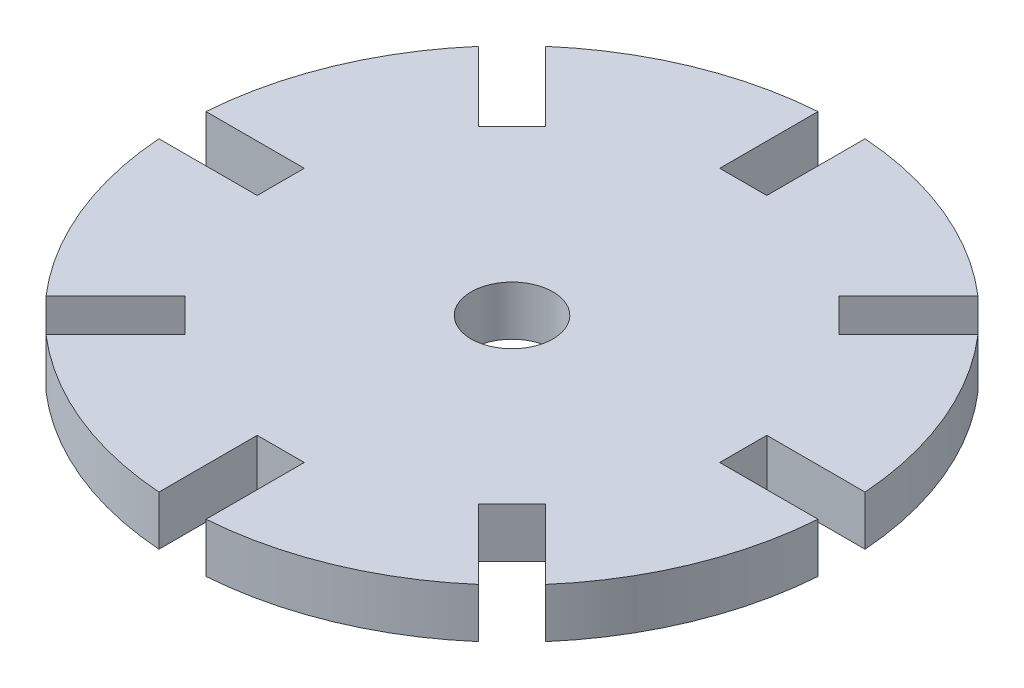
ISO-10303-21;
HEADER;
FILE_DESCRIPTION(('STEP AP214'),'2;1');
FILE_NAME('part.step','',(''),(''),'','','');
FILE_SCHEMA(('AUTOMOTIVE_DESIGN { 1 0 10303 214 1 1 1 1 }'));
ENDSEC;
DATA;
#1=APPLICATION_CONTEXT('core data for automotive mechanical design processes');
#2=APPLICATION_PROTOCOL_DEFINITION('international standard','automotive_design',2000,#1);
#3=PRODUCT_CONTEXT('',#1,'mechanical');
#4=PRODUCT('Part','Part','',(#3));
#5=PRODUCT_RELATED_PRODUCT_CATEGORY('part','',(#4));
#6=PRODUCT_DEFINITION_FORMATION('','',#4);
#7=PRODUCT_DEFINITION_CONTEXT('part definition',#1,'design');
#8=PRODUCT_DEFINITION('design','',#6,#7);
#9=PRODUCT_DEFINITION_SHAPE('','',#8);
#10=(LENGTH_UNIT() NAMED_UNIT(*) SI_UNIT(.MILLI.,.METRE.));
#11=(NAMED_UNIT(*) PLANE_ANGLE_UNIT() SI_UNIT($,.RADIAN.));
#12=(NAMED_UNIT(*) SI_UNIT($,.STERADIAN.) SOLID_ANGLE_UNIT());
#13=UNCERTAINTY_MEASURE_WITH_UNIT(LENGTH_MEASURE(1.E-05),#10,'distance_accuracy_value','');
#14=(GEOMETRIC_REPRESENTATION_CONTEXT(3) GLOBAL_UNCERTAINTY_ASSIGNED_CONTEXT((#13)) GLOBAL_UNIT_ASSIGNED_CONTEXT((#10,
#11,#12)) REPRESENTATION_CONTEXT('',''));
#15=CARTESIAN_POINT('',(0.,0.,0.));
#16=DIRECTION('',(0.,0.,1.));
#17=DIRECTION('',(1.,0.,0.));
#18=AXIS2_PLACEMENT_3D('',#15,#16,#17);
#19=CARTESIAN_POINT('',(0.,-1.5,0.));
#20=DIRECTION('',(0.,1.,0.));
#21=DIRECTION('',(0.,0.,1.));
#22=AXIS2_PLACEMENT_3D('',#19,#20,#21);
#23=CYLINDRICAL_SURFACE('',#22,20.);
#24=DIRECTION('',(0.,1.,0.));
#25=VECTOR('',#24,1.);
#26=CARTESIAN_POINT('',(1.42499999999994,-1.5,19.949169782224));
#27=LINE('',#26,#25);
#28=CARTESIAN_POINT('',(1.42499999999994,-1.5,19.949169782224));
#29=VERTEX_POINT('',#28);
#30=CARTESIAN_POINT('',(1.42499999999994,1.5,19.949169782224));
#31=VERTEX_POINT('',#30);
#32=EDGE_CURVE('E421',#29,#31,#27,.T.);
#33=ORIENTED_EDGE('',*,*,#32,.F.);
#34=CARTESIAN_POINT('',(0.,-1.5,0.));
#35=DIRECTION('',(0.,1.,0.));
#36=DIRECTION('',(0.,0.,1.));
#37=AXIS2_PLACEMENT_3D('',#34,#35,#36);
#38=CIRCLE('',#37,20.);
#39=CARTESIAN_POINT('',(13.0985660688615,-1.5,15.1138203952432));
#40=VERTEX_POINT('',#39);
#41=EDGE_CURVE('E507',#29,#40,#38,.T.);
#42=ORIENTED_EDGE('',*,*,#41,.T.);
#43=DIRECTION('',(0.,1.,0.));
#44=VECTOR('',#43,1.);
#45=CARTESIAN_POINT('',(13.0985660688615,-1.5,15.1138203952432));
#46=LINE('',#45,#44);
#47=CARTESIAN_POINT('',(13.0985660688615,1.5,15.1138203952432));
#48=VERTEX_POINT('',#47);
#49=EDGE_CURVE('E394',#48,#40,#46,.F.);
#50=ORIENTED_EDGE('',*,*,#49,.F.);
#51=CARTESIAN_POINT('',(0.,1.5,0.));
#52=DIRECTION('',(0.,1.,0.));
#53=DIRECTION('',(0.,0.,1.));
#54=AXIS2_PLACEMENT_3D('',#51,#52,#53);
#55=CIRCLE('',#54,20.);
#56=EDGE_CURVE('E533',#31,#48,#55,.T.);
#57=ORIENTED_EDGE('',*,*,#56,.F.);
#58=EDGE_LOOP('',(#33,#42,#50,#57));
#59=FACE_BOUND('',#58,.T.);
#60=ADVANCED_FACE('F45',(#59),#23,.T.);
#61=DIRECTION('',(0.,1.,0.));
#62=VECTOR('',#61,1.);
#63=CARTESIAN_POINT('',(-1.42500000000007,-1.5,19.949169782224));
#64=LINE('',#63,#62);
#65=CARTESIAN_POINT('',(-1.42500000000007,1.5,19.949169782224));
#66=VERTEX_POINT('',#65);
#67=CARTESIAN_POINT('',(-1.42500000000007,-1.5,19.949169782224));
#68=VERTEX_POINT('',#67);
#69=EDGE_CURVE('E419',#66,#68,#64,.F.);
#70=ORIENTED_EDGE('',*,*,#69,.F.);
#71=CARTESIAN_POINT('',(-13.0985660688616,1.5,15.1138203952431));
#72=VERTEX_POINT('',#71);
#73=EDGE_CURVE('E535',#72,#66,#55,.T.);
#74=ORIENTED_EDGE('',*,*,#73,.F.);
#75=DIRECTION('',(0.,1.,0.));
#76=VECTOR('',#75,1.);
#77=CARTESIAN_POINT('',(-13.0985660688616,-1.5,15.1138203952431));
#78=LINE('',#77,#76);
#79=CARTESIAN_POINT('',(-13.0985660688616,-1.5,15.1138203952431));
#80=VERTEX_POINT('',#79);
#81=EDGE_CURVE('E417',#80,#72,#78,.T.);
#82=ORIENTED_EDGE('',*,*,#81,.F.);
#83=EDGE_CURVE('E503',#80,#68,#38,.T.);
#84=ORIENTED_EDGE('',*,*,#83,.T.);
#85=EDGE_LOOP('',(#70,#74,#82,#84));
#86=FACE_BOUND('',#85,.T.);
#87=ADVANCED_FACE('F594',(#86),#23,.T.);
#88=DIRECTION('',(0.,1.,0.));
#89=VECTOR('',#88,1.);
#90=CARTESIAN_POINT('',(-15.1138203952433,-1.5,13.0985660688615));
#91=LINE('',#90,#89);
#92=CARTESIAN_POINT('',(-15.1138203952433,1.5,13.0985660688615));
#93=VERTEX_POINT('',#92);
#94=CARTESIAN_POINT('',(-15.1138203952433,-1.5,13.0985660688615));
#95=VERTEX_POINT('',#94);
#96=EDGE_CURVE('E415',#93,#95,#91,.F.);
#97=ORIENTED_EDGE('',*,*,#96,.F.);
#98=CARTESIAN_POINT('',(-19.949169782224,1.5,1.42500000000001));
#99=VERTEX_POINT('',#98);
#100=EDGE_CURVE('E491',#99,#93,#55,.T.);
#101=ORIENTED_EDGE('',*,*,#100,.F.);
#102=DIRECTION('',(0.,1.,0.));
#103=VECTOR('',#102,1.);
#104=CARTESIAN_POINT('',(-19.949169782224,-1.5,1.42500000000001));
#105=LINE('',#104,#103);
#106=CARTESIAN_POINT('',(-19.949169782224,-1.5,1.42500000000001));
#107=VERTEX_POINT('',#106);
#108=EDGE_CURVE('E413',#107,#99,#105,.T.);
#109=ORIENTED_EDGE('',*,*,#108,.F.);
#110=EDGE_CURVE('E501',#107,#95,#38,.T.);
#111=ORIENTED_EDGE('',*,*,#110,.T.);
#112=EDGE_LOOP('',(#97,#101,#109,#111));
#113=FACE_BOUND('',#112,.T.);
#114=ADVANCED_FACE('F498',(#113),#23,.T.);
#115=DIRECTION('',(0.,1.,0.));
#116=VECTOR('',#115,1.);
#117=CARTESIAN_POINT('',(-19.949169782224,-1.5,-1.425));
#118=LINE('',#117,#116);
#119=CARTESIAN_POINT('',(-19.949169782224,1.5,-1.425));
#120=VERTEX_POINT('',#119);
#121=CARTESIAN_POINT('',(-19.949169782224,-1.5,-1.425));
#122=VERTEX_POINT('',#121);
#123=EDGE_CURVE('E411',#120,#122,#118,.F.);
#124=ORIENTED_EDGE('',*,*,#123,.F.);
#125=CARTESIAN_POINT('',(-15.1138203952431,1.5,-13.0985660688617));
#126=VERTEX_POINT('',#125);
#127=EDGE_CURVE('E539',#126,#120,#55,.T.);
#128=ORIENTED_EDGE('',*,*,#127,.F.);
#129=DIRECTION('',(0.,1.,0.));
#130=VECTOR('',#129,1.);
#131=CARTESIAN_POINT('',(-15.1138203952431,-1.5,-13.0985660688617));
#132=LINE('',#131,#130);
#133=CARTESIAN_POINT('',(-15.1138203952431,-1.5,-13.0985660688617));
#134=VERTEX_POINT('',#133);
#135=EDGE_CURVE('E409',#134,#126,#132,.T.);
#136=ORIENTED_EDGE('',*,*,#135,.F.);
#137=EDGE_CURVE('E502',#134,#122,#38,.T.);
#138=ORIENTED_EDGE('',*,*,#137,.T.);
#139=EDGE_LOOP('',(#124,#128,#136,#138));
#140=FACE_BOUND('',#139,.T.);
#141=ADVANCED_FACE('F574',(#140),#23,.T.);
#142=DIRECTION('',(0.,1.,0.));
#143=VECTOR('',#142,1.);
#144=CARTESIAN_POINT('',(-13.0985660688614,-1.5,-15.1138203952433));
#145=LINE('',#144,#143);
#146=CARTESIAN_POINT('',(-13.0985660688614,1.5,-15.1138203952433));
#147=VERTEX_POINT('',#146);
#148=CARTESIAN_POINT('',(-13.0985660688614,-1.5,-15.1138203952433));
#149=VERTEX_POINT('',#148);
#150=EDGE_CURVE('E407',#147,#149,#145,.F.);
#151=ORIENTED_EDGE('',*,*,#150,.F.);
#152=CARTESIAN_POINT('',(-1.4249999999998,1.5,-19.949169782224));
#153=VERTEX_POINT('',#152);
#154=EDGE_CURVE('E541',#153,#147,#55,.T.);
#155=ORIENTED_EDGE('',*,*,#154,.F.);
#156=DIRECTION('',(0.,1.,0.));
#157=VECTOR('',#156,1.);
#158=CARTESIAN_POINT('',(-1.4249999999998,-1.5,-19.949169782224));
#159=LINE('',#158,#157);
#160=CARTESIAN_POINT('',(-1.4249999999998,-1.5,-19.949169782224));
#161=VERTEX_POINT('',#160);
#162=EDGE_CURVE('E405',#161,#153,#159,.T.);
#163=ORIENTED_EDGE('',*,*,#162,.F.);
#164=EDGE_CURVE('E505',#161,#149,#38,.T.);
#165=ORIENTED_EDGE('',*,*,#164,.T.);
#166=EDGE_LOOP('',(#151,#155,#163,#165));
#167=FACE_BOUND('',#166,.T.);
#168=ADVANCED_FACE('F560',(#167),#23,.T.);
#169=DIRECTION('',(0.,1.,0.));
#170=VECTOR('',#169,1.);
#171=CARTESIAN_POINT('',(1.42500000000021,-1.5,-19.949169782224));
#172=LINE('',#171,#170);
#173=CARTESIAN_POINT('',(1.42500000000021,1.5,-19.949169782224));
#174=VERTEX_POINT('',#173);
#175=CARTESIAN_POINT('',(1.42500000000021,-1.5,-19.949169782224));
#176=VERTEX_POINT('',#175);
#177=EDGE_CURVE('E273',#174,#176,#172,.F.);
#178=ORIENTED_EDGE('',*,*,#177,.F.);
#179=CARTESIAN_POINT('',(13.0985660688617,1.5,-15.113820395243));
#180=VERTEX_POINT('',#179);
#181=EDGE_CURVE('E456',#180,#174,#55,.T.);
#182=ORIENTED_EDGE('',*,*,#181,.F.);
#183=DIRECTION('',(0.,1.,0.));
#184=VECTOR('',#183,1.);
#185=CARTESIAN_POINT('',(13.0985660688617,-1.5,-15.113820395243));
#186=LINE('',#185,#184);
#187=CARTESIAN_POINT('',(13.0985660688617,-1.5,-15.113820395243));
#188=VERTEX_POINT('',#187);
#189=EDGE_CURVE('E402',#188,#180,#186,.T.);
#190=ORIENTED_EDGE('',*,*,#189,.F.);
#191=EDGE_CURVE('E464',#188,#176,#38,.T.);
#192=ORIENTED_EDGE('',*,*,#191,.T.);
#193=EDGE_LOOP('',(#178,#182,#190,#192));
#194=FACE_BOUND('',#193,.T.);
#195=ADVANCED_FACE('F555',(#194),#23,.T.);
#196=DIRECTION('',(0.,1.,0.));
#197=VECTOR('',#196,1.);
#198=CARTESIAN_POINT('',(15.1138203952432,-1.5,13.0985660688616));
#199=LINE('',#198,#197);
#200=CARTESIAN_POINT('',(15.1138203952432,-1.5,13.0985660688616));
#201=VERTEX_POINT('',#200);
#202=CARTESIAN_POINT('',(15.1138203952432,1.5,13.0985660688616));
#203=VERTEX_POINT('',#202);
#204=EDGE_CURVE('E398',#201,#203,#199,.T.);
#205=ORIENTED_EDGE('',*,*,#204,.F.);
#206=CARTESIAN_POINT('',(19.949169782224,-1.5,1.425));
#207=VERTEX_POINT('',#206);
#208=EDGE_CURVE('E459',#201,#207,#38,.T.);
#209=ORIENTED_EDGE('',*,*,#208,.T.);
#210=DIRECTION('',(0.,1.,0.));
#211=VECTOR('',#210,1.);
#212=CARTESIAN_POINT('',(19.949169782224,-1.5,1.425));
#213=LINE('',#212,#211);
#214=CARTESIAN_POINT('',(19.949169782224,1.5,1.425));
#215=VERTEX_POINT('',#214);
#216=EDGE_CURVE('E441',#215,#207,#213,.F.);
#217=ORIENTED_EDGE('',*,*,#216,.F.);
#218=EDGE_CURVE('E451',#203,#215,#55,.T.);
#219=ORIENTED_EDGE('',*,*,#218,.F.);
#220=EDGE_LOOP('',(#205,#209,#217,#219));
#221=FACE_BOUND('',#220,.T.);
#222=ADVANCED_FACE('F519',(#221),#23,.T.);
#223=DIRECTION('',(0.,1.,0.));
#224=VECTOR('',#223,1.);
#225=CARTESIAN_POINT('',(15.1138203952434,-1.5,-13.0985660688614));
#226=LINE('',#225,#224);
#227=CARTESIAN_POINT('',(15.1138203952434,1.5,-13.0985660688614));
#228=VERTEX_POINT('',#227);
#229=CARTESIAN_POINT('',(15.1138203952434,-1.5,-13.0985660688614));
#230=VERTEX_POINT('',#229);
#231=EDGE_CURVE('E400',#228,#230,#226,.F.);
#232=ORIENTED_EDGE('',*,*,#231,.F.);
#233=CARTESIAN_POINT('',(19.949169782224,1.5,-1.42500000000001));
#234=VERTEX_POINT('',#233);
#235=EDGE_CURVE('E452',#234,#228,#55,.T.);
#236=ORIENTED_EDGE('',*,*,#235,.F.);
#237=DIRECTION('',(0.,1.,0.));
#238=VECTOR('',#237,1.);
#239=CARTESIAN_POINT('',(19.949169782224,-1.5,-1.42500000000001));
#240=LINE('',#239,#238);
#241=CARTESIAN_POINT('',(19.949169782224,-1.5,-1.42500000000001));
#242=VERTEX_POINT('',#241);
#243=EDGE_CURVE('E446',#242,#234,#240,.T.);
#244=ORIENTED_EDGE('',*,*,#243,.F.);
#245=EDGE_CURVE('E460',#242,#230,#38,.T.);
#246=ORIENTED_EDGE('',*,*,#245,.T.);
#247=EDGE_LOOP('',(#232,#236,#244,#246));
#248=FACE_BOUND('',#247,.T.);
#249=ADVANCED_FACE('F47',(#248),#23,.T.);
#250=CARTESIAN_POINT('',(0.,-1.5,0.));
#251=DIRECTION('',(0.,1.,0.));
#252=DIRECTION('',(0.,0.,1.));
#253=AXIS2_PLACEMENT_3D('',#250,#251,#252);
#254=PLANE('',#253);
#255=CARTESIAN_POINT('',(0.,-1.5,0.));
#256=DIRECTION('',(0.,1.,0.));
#257=DIRECTION('',(0.,0.,1.));
#258=AXIS2_PLACEMENT_3D('',#255,#256,#257);
#259=CIRCLE('',#258,2.475);
#260=CARTESIAN_POINT('',(0.,-1.5,2.475));
#261=VERTEX_POINT('',#260);
#262=EDGE_CURVE('E455',#261,#261,#259,.T.);
#263=ORIENTED_EDGE('',*,*,#262,.T.);
#264=EDGE_LOOP('',(#263));
#265=FACE_BOUND('',#264,.T.);
#266=ORIENTED_EDGE('',*,*,#41,.F.);
#267=DIRECTION('',(0.,0.,-1.));
#268=VECTOR('',#267,1.);
#269=CARTESIAN_POINT('',(1.42499999999991,-1.5,26.));
#270=LINE('',#269,#268);
#271=CARTESIAN_POINT('',(1.42499999999997,-1.5,14.));
#272=VERTEX_POINT('',#271);
#273=EDGE_CURVE('E315',#29,#272,#270,.T.);
#274=ORIENTED_EDGE('',*,*,#273,.T.);
#275=DIRECTION('',(-1.,0.,0.));
#276=VECTOR('',#275,1.);
#277=CARTESIAN_POINT('',(-1.42500000000006,-1.5,14.));
#278=LINE('',#277,#276);
#279=CARTESIAN_POINT('',(-1.42500000000006,-1.5,14.));
#280=VERTEX_POINT('',#279);
#281=EDGE_CURVE('E308',#272,#280,#278,.T.);
#282=ORIENTED_EDGE('',*,*,#281,.T.);
#283=DIRECTION('',(0.,0.,1.));
#284=VECTOR('',#283,1.);
#285=CARTESIAN_POINT('',(-1.42500000000009,-1.5,26.));
#286=LINE('',#285,#284);
#287=EDGE_CURVE('E311',#280,#68,#286,.T.);
#288=ORIENTED_EDGE('',*,*,#287,.T.);
#289=ORIENTED_EDGE('',*,*,#83,.F.);
#290=DIRECTION('',(0.707106781186552,0.,-0.707106781186543));
#291=VECTOR('',#290,1.);
#292=CARTESIAN_POINT('',(-17.3771491476595,-1.5,19.392403474041));
#293=LINE('',#292,#291);
#294=CARTESIAN_POINT('',(-8.89186777342088,-1.5,10.9071220998025));
#295=VERTEX_POINT('',#294);
#296=EDGE_CURVE('E333',#80,#295,#293,.T.);
#297=ORIENTED_EDGE('',*,*,#296,.T.);
#298=DIRECTION('',(-0.707106781186543,0.,-0.707106781186552));
#299=VECTOR('',#298,1.);
#300=CARTESIAN_POINT('',(-10.9071220998025,-1.5,8.89186777342077));
#301=LINE('',#300,#299);
#302=CARTESIAN_POINT('',(-10.9071220998025,-1.5,8.89186777342077));
#303=VERTEX_POINT('',#302);
#304=EDGE_CURVE('E326',#295,#303,#301,.T.);
#305=ORIENTED_EDGE('',*,*,#304,.T.);
#306=DIRECTION('',(-0.70710678118655,0.,0.707106781186545));
#307=VECTOR('',#306,1.);
#308=CARTESIAN_POINT('',(-19.3924034740412,-1.5,17.3771491476593));
#309=LINE('',#308,#307);
#310=EDGE_CURVE('E329',#303,#95,#309,.T.);
#311=ORIENTED_EDGE('',*,*,#310,.T.);
#312=ORIENTED_EDGE('',*,*,#110,.F.);
#313=DIRECTION('',(1.,0.,0.));
#314=VECTOR('',#313,1.);
#315=CARTESIAN_POINT('',(-26.,-1.5,1.425));
#316=LINE('',#315,#314);
#317=CARTESIAN_POINT('',(-14.,-1.5,1.42500000000002));
#318=VERTEX_POINT('',#317);
#319=EDGE_CURVE('E349',#107,#318,#316,.T.);
#320=ORIENTED_EDGE('',*,*,#319,.T.);
#321=DIRECTION('',(0.,0.,-1.));
#322=VECTOR('',#321,1.);
#323=CARTESIAN_POINT('',(-14.,-1.5,-1.42500000000001));
#324=LINE('',#323,#322);
#325=CARTESIAN_POINT('',(-14.,-1.5,-1.42500000000001));
#326=VERTEX_POINT('',#325);
#327=EDGE_CURVE('E342',#318,#326,#324,.T.);
#328=ORIENTED_EDGE('',*,*,#327,.T.);
#329=DIRECTION('',(-1.,0.,0.));
#330=VECTOR('',#329,1.);
#331=CARTESIAN_POINT('',(-26.,-1.5,-1.425));
#332=LINE('',#331,#330);
#333=EDGE_CURVE('E345',#326,#122,#332,.T.);
#334=ORIENTED_EDGE('',*,*,#333,.T.);
#335=ORIENTED_EDGE('',*,*,#137,.F.);
#336=DIRECTION('',(0.707106781186541,0.,0.707106781186554));
#337=VECTOR('',#336,1.);
#338=CARTESIAN_POINT('',(-19.3924034740409,-1.5,-17.3771491476596));
#339=LINE('',#338,#337);
#340=CARTESIAN_POINT('',(-10.9071220998024,-1.5,-8.89186777342092));
#341=VERTEX_POINT('',#340);
#342=EDGE_CURVE('E368',#134,#341,#339,.T.);
#343=ORIENTED_EDGE('',*,*,#342,.T.);
#344=DIRECTION('',(0.707106781186555,0.,-0.70710678118654));
#345=VECTOR('',#344,1.);
#346=CARTESIAN_POINT('',(-8.89186777342073,-1.5,-10.9071220998026));
#347=LINE('',#346,#345);
#348=CARTESIAN_POINT('',(-8.89186777342073,-1.5,-10.9071220998026));
#349=VERTEX_POINT('',#348);
#350=EDGE_CURVE('E361',#341,#349,#347,.T.);
#351=ORIENTED_EDGE('',*,*,#350,.T.);
#352=DIRECTION('',(-0.707106781186542,0.,-0.707106781186553));
#353=VECTOR('',#352,1.);
#354=CARTESIAN_POINT('',(-17.3771491476592,-1.5,-19.3924034740412));
#355=LINE('',#354,#353);
#356=EDGE_CURVE('E364',#349,#149,#355,.T.);
#357=ORIENTED_EDGE('',*,*,#356,.T.);
#358=ORIENTED_EDGE('',*,*,#164,.F.);
#359=DIRECTION('',(0.,0.,1.));
#360=VECTOR('',#359,1.);
#361=CARTESIAN_POINT('',(-1.42499999999973,-1.5,-26.));
#362=LINE('',#361,#360);
#363=CARTESIAN_POINT('',(-1.42499999999987,-1.5,-14.));
#364=VERTEX_POINT('',#363);
#365=EDGE_CURVE('E267',#161,#364,#362,.T.);
#366=ORIENTED_EDGE('',*,*,#365,.T.);
#367=DIRECTION('',(1.,0.,0.));
#368=VECTOR('',#367,1.);
#369=CARTESIAN_POINT('',(1.42500000000016,-1.5,-14.));
#370=LINE('',#369,#368);
#371=CARTESIAN_POINT('',(1.42500000000016,-1.5,-14.));
#372=VERTEX_POINT('',#371);
#373=EDGE_CURVE('E260',#364,#372,#370,.T.);
#374=ORIENTED_EDGE('',*,*,#373,.T.);
#375=DIRECTION('',(0.,0.,-1.));
#376=VECTOR('',#375,1.);
#377=CARTESIAN_POINT('',(1.42500000000027,-1.5,-26.));
#378=LINE('',#377,#376);
#379=EDGE_CURVE('E270',#372,#176,#378,.T.);
#380=ORIENTED_EDGE('',*,*,#379,.T.);
#381=ORIENTED_EDGE('',*,*,#191,.F.);
#382=DIRECTION('',(-0.707106781186557,0.,0.707106781186538));
#383=VECTOR('',#382,1.);
#384=CARTESIAN_POINT('',(17.3771491476596,-1.5,-19.3924034740409));
#385=LINE('',#384,#383);
#386=CARTESIAN_POINT('',(8.89186777342096,-1.5,-10.9071220998024));
#387=VERTEX_POINT('',#386);
#388=EDGE_CURVE('E297',#188,#387,#385,.T.);
#389=ORIENTED_EDGE('',*,*,#388,.T.);
#390=DIRECTION('',(0.707106781186538,0.,0.707106781186557));
#391=VECTOR('',#390,1.);
#392=CARTESIAN_POINT('',(10.9071220998026,-1.5,-8.89186777342069));
#393=LINE('',#392,#391);
#394=CARTESIAN_POINT('',(10.9071220998026,-1.5,-8.89186777342069));
#395=VERTEX_POINT('',#394);
#396=EDGE_CURVE('E290',#387,#395,#393,.T.);
#397=ORIENTED_EDGE('',*,*,#396,.T.);
#398=DIRECTION('',(0.707106781186555,0.,-0.70710678118654));
#399=VECTOR('',#398,1.);
#400=CARTESIAN_POINT('',(19.3924034740413,-1.5,-17.3771491476592));
#401=LINE('',#400,#399);
#402=EDGE_CURVE('E293',#395,#230,#401,.T.);
#403=ORIENTED_EDGE('',*,*,#402,.T.);
#404=ORIENTED_EDGE('',*,*,#245,.F.);
#405=DIRECTION('',(-1.,0.,0.));
#406=VECTOR('',#405,1.);
#407=CARTESIAN_POINT('',(26.,-1.5,-1.425));
#408=LINE('',#407,#406);
#409=CARTESIAN_POINT('',(14.,-1.5,-1.42500000000002));
#410=VERTEX_POINT('',#409);
#411=EDGE_CURVE('E431',#242,#410,#408,.T.);
#412=ORIENTED_EDGE('',*,*,#411,.T.);
#413=DIRECTION('',(0.,0.,1.));
#414=VECTOR('',#413,1.);
#415=CARTESIAN_POINT('',(14.,-1.5,1.42500000000001));
#416=LINE('',#415,#414);
#417=CARTESIAN_POINT('',(14.,-1.5,1.42500000000001));
#418=VERTEX_POINT('',#417);
#419=EDGE_CURVE('E424',#410,#418,#416,.T.);
#420=ORIENTED_EDGE('',*,*,#419,.T.);
#421=DIRECTION('',(1.,0.,0.));
#422=VECTOR('',#421,1.);
#423=CARTESIAN_POINT('',(26.,-1.5,1.425));
#424=LINE('',#423,#422);
#425=EDGE_CURVE('E427',#418,#207,#424,.T.);
#426=ORIENTED_EDGE('',*,*,#425,.T.);
#427=ORIENTED_EDGE('',*,*,#208,.F.);
#428=DIRECTION('',(-0.707106781186546,0.,-0.707106781186549));
#429=VECTOR('',#428,1.);
#430=CARTESIAN_POINT('',(19.392403474041,-1.5,17.3771491476594));
#431=LINE('',#430,#429);
#432=CARTESIAN_POINT('',(10.9071220998025,-1.5,8.89186777342084));
#433=VERTEX_POINT('',#432);
#434=EDGE_CURVE('E385',#201,#433,#431,.T.);
#435=ORIENTED_EDGE('',*,*,#434,.T.);
#436=DIRECTION('',(-0.70710678118655,0.,0.707106781186545));
#437=VECTOR('',#436,1.);
#438=CARTESIAN_POINT('',(8.89186777342081,-1.5,10.9071220998025));
#439=LINE('',#438,#437);
#440=CARTESIAN_POINT('',(8.89186777342081,-1.5,10.9071220998025));
#441=VERTEX_POINT('',#440);
#442=EDGE_CURVE('E378',#433,#441,#439,.T.);
#443=ORIENTED_EDGE('',*,*,#442,.T.);
#444=DIRECTION('',(0.707106781186547,0.,0.707106781186548));
#445=VECTOR('',#444,1.);
#446=CARTESIAN_POINT('',(17.3771491476594,-1.5,19.3924034740411));
#447=LINE('',#446,#445);
#448=EDGE_CURVE('E381',#441,#40,#447,.T.);
#449=ORIENTED_EDGE('',*,*,#448,.T.);
#450=EDGE_LOOP('',(#266,#274,#282,#288,#289,#297,#305,#311,#312,#320,#328,#334,#335,#343,#351,
#357,#358,#366,#374,#380,#381,#389,#397,#403,#404,#412,#420,#426,#427,#435,#443,#449));
#451=FACE_BOUND('',#450,.T.);
#452=ADVANCED_FACE('F279',(#265,#451),#254,.F.);
#453=CARTESIAN_POINT('',(0.,-1.5,0.));
#454=DIRECTION('',(0.,1.,0.));
#455=DIRECTION('',(0.,0.,1.));
#456=AXIS2_PLACEMENT_3D('',#453,#454,#455);
#457=CYLINDRICAL_SURFACE('',#456,2.475);
#458=ORIENTED_EDGE('',*,*,#262,.F.);
#459=EDGE_LOOP('',(#458));
#460=FACE_BOUND('',#459,.T.);
#461=CARTESIAN_POINT('',(0.,1.5,0.));
#462=DIRECTION('',(0.,1.,0.));
#463=DIRECTION('',(0.,0.,1.));
#464=AXIS2_PLACEMENT_3D('',#461,#462,#463);
#465=CIRCLE('',#464,2.475);
#466=CARTESIAN_POINT('',(0.,1.5,2.475));
#467=VERTEX_POINT('',#466);
#468=EDGE_CURVE('E448',#467,#467,#465,.T.);
#469=ORIENTED_EDGE('',*,*,#468,.T.);
#470=EDGE_LOOP('',(#469));
#471=FACE_BOUND('',#470,.T.);
#472=ADVANCED_FACE('F604',(#460,#471),#457,.F.);
#473=CARTESIAN_POINT('',(0.,1.5,0.));
#474=DIRECTION('',(0.,1.,0.));
#475=DIRECTION('',(0.,0.,1.));
#476=AXIS2_PLACEMENT_3D('',#473,#474,#475);
#477=PLANE('',#476);
#478=DIRECTION('',(0.,0.,-1.));
#479=VECTOR('',#478,1.);
#480=CARTESIAN_POINT('',(1.42500000000003,1.5,0.));
#481=LINE('',#480,#479);
#482=CARTESIAN_POINT('',(1.42499999999997,1.5,14.));
#483=VERTEX_POINT('',#482);
#484=EDGE_CURVE('E13',#31,#483,#481,.T.);
#485=ORIENTED_EDGE('',*,*,#484,.F.);
#486=ORIENTED_EDGE('',*,*,#56,.T.);
#487=DIRECTION('',(0.707106781186547,0.,0.707106781186548));
#488=VECTOR('',#487,1.);
#489=CARTESIAN_POINT('',(17.3771491476594,1.5,19.3924034740411));
#490=LINE('',#489,#488);
#491=CARTESIAN_POINT('',(8.89186777342081,1.5,10.9071220998025));
#492=VERTEX_POINT('',#491);
#493=EDGE_CURVE('E382',#492,#48,#490,.T.);
#494=ORIENTED_EDGE('',*,*,#493,.F.);
#495=DIRECTION('',(-0.70710678118655,0.,0.707106781186545));
#496=VECTOR('',#495,1.);
#497=CARTESIAN_POINT('',(8.89186777342081,1.5,10.9071220998025));
#498=LINE('',#497,#496);
#499=CARTESIAN_POINT('',(10.9071220998025,1.5,8.89186777342084));
#500=VERTEX_POINT('',#499);
#501=EDGE_CURVE('E324',#500,#492,#498,.T.);
#502=ORIENTED_EDGE('',*,*,#501,.F.);
#503=DIRECTION('',(-0.707106781186546,0.,-0.707106781186549));
#504=VECTOR('',#503,1.);
#505=CARTESIAN_POINT('',(1.00762716319085,1.5,-1.00762716319085));
#506=LINE('',#505,#504);
#507=EDGE_CURVE('E466',#203,#500,#506,.T.);
#508=ORIENTED_EDGE('',*,*,#507,.F.);
#509=ORIENTED_EDGE('',*,*,#218,.T.);
#510=DIRECTION('',(1.,0.,0.));
#511=VECTOR('',#510,1.);
#512=CARTESIAN_POINT('',(26.,1.5,1.425));
#513=LINE('',#512,#511);
#514=CARTESIAN_POINT('',(14.,1.5,1.42500000000001));
#515=VERTEX_POINT('',#514);
#516=EDGE_CURVE('E428',#515,#215,#513,.T.);
#517=ORIENTED_EDGE('',*,*,#516,.F.);
#518=DIRECTION('',(0.,0.,1.));
#519=VECTOR('',#518,1.);
#520=CARTESIAN_POINT('',(14.,1.5,1.42500000000001));
#521=LINE('',#520,#519);
#522=CARTESIAN_POINT('',(14.,1.5,-1.42500000000002));
#523=VERTEX_POINT('',#522);
#524=EDGE_CURVE('E423',#523,#515,#521,.T.);
#525=ORIENTED_EDGE('',*,*,#524,.F.);
#526=DIRECTION('',(-1.,0.,0.));
#527=VECTOR('',#526,1.);
#528=CARTESIAN_POINT('',(0.,1.5,-1.42500000000003));
#529=LINE('',#528,#527);
#530=EDGE_CURVE('E463',#234,#523,#529,.T.);
#531=ORIENTED_EDGE('',*,*,#530,.F.);
#532=ORIENTED_EDGE('',*,*,#235,.T.);
#533=DIRECTION('',(0.707106781186555,0.,-0.70710678118654));
#534=VECTOR('',#533,1.);
#535=CARTESIAN_POINT('',(19.3924034740413,1.5,-17.3771491476592));
#536=LINE('',#535,#534);
#537=CARTESIAN_POINT('',(10.9071220998026,1.5,-8.89186777342069));
#538=VERTEX_POINT('',#537);
#539=EDGE_CURVE('E294',#538,#228,#536,.T.);
#540=ORIENTED_EDGE('',*,*,#539,.F.);
#541=DIRECTION('',(0.707106781186538,0.,0.707106781186557));
#542=VECTOR('',#541,1.);
#543=CARTESIAN_POINT('',(10.9071220998026,1.5,-8.89186777342069));
#544=LINE('',#543,#542);
#545=CARTESIAN_POINT('',(8.89186777342096,1.5,-10.9071220998024));
#546=VERTEX_POINT('',#545);
#547=EDGE_CURVE('E301',#546,#538,#544,.T.);
#548=ORIENTED_EDGE('',*,*,#547,.F.);
#549=DIRECTION('',(-0.707106781186557,0.,0.707106781186538));
#550=VECTOR('',#549,1.);
#551=CARTESIAN_POINT('',(-1.00762716319084,1.5,-1.00762716319086));
#552=LINE('',#551,#550);
#553=EDGE_CURVE('E468',#180,#546,#552,.T.);
#554=ORIENTED_EDGE('',*,*,#553,.F.);
#555=ORIENTED_EDGE('',*,*,#181,.T.);
#556=DIRECTION('',(0.,0.,-1.));
#557=VECTOR('',#556,1.);
#558=CARTESIAN_POINT('',(1.42500000000027,1.5,-26.));
#559=LINE('',#558,#557);
#560=CARTESIAN_POINT('',(1.42500000000016,1.5,-14.));
#561=VERTEX_POINT('',#560);
#562=EDGE_CURVE('E281',#561,#174,#559,.T.);
#563=ORIENTED_EDGE('',*,*,#562,.F.);
#564=DIRECTION('',(1.,0.,0.));
#565=VECTOR('',#564,1.);
#566=CARTESIAN_POINT('',(1.42500000000016,1.5,-14.));
#567=LINE('',#566,#565);
#568=CARTESIAN_POINT('',(-1.42499999999987,1.5,-14.));
#569=VERTEX_POINT('',#568);
#570=EDGE_CURVE('E263',#569,#561,#567,.T.);
#571=ORIENTED_EDGE('',*,*,#570,.F.);
#572=DIRECTION('',(0.,0.,1.));
#573=VECTOR('',#572,1.);
#574=CARTESIAN_POINT('',(-1.42500000000003,1.5,0.));
#575=LINE('',#574,#573);
#576=EDGE_CURVE('E470',#153,#569,#575,.T.);
#577=ORIENTED_EDGE('',*,*,#576,.F.);
#578=ORIENTED_EDGE('',*,*,#154,.T.);
#579=DIRECTION('',(-0.707106781186542,0.,-0.707106781186553));
#580=VECTOR('',#579,1.);
#581=CARTESIAN_POINT('',(-17.3771491476592,1.5,-19.3924034740412));
#582=LINE('',#581,#580);
#583=CARTESIAN_POINT('',(-8.89186777342073,1.5,-10.9071220998026));
#584=VERTEX_POINT('',#583);
#585=EDGE_CURVE('E365',#584,#147,#582,.T.);
#586=ORIENTED_EDGE('',*,*,#585,.F.);
#587=DIRECTION('',(0.707106781186555,0.,-0.70710678118654));
#588=VECTOR('',#587,1.);
#589=CARTESIAN_POINT('',(-8.89186777342073,1.5,-10.9071220998026));
#590=LINE('',#589,#588);
#591=CARTESIAN_POINT('',(-10.9071220998024,1.5,-8.89186777342092));
#592=VERTEX_POINT('',#591);
#593=EDGE_CURVE('E288',#592,#584,#590,.T.);
#594=ORIENTED_EDGE('',*,*,#593,.F.);
#595=DIRECTION('',(0.707106781186541,0.,0.707106781186554));
#596=VECTOR('',#595,1.);
#597=CARTESIAN_POINT('',(-1.00762716319086,1.5,1.00762716319084));
#598=LINE('',#597,#596);
#599=EDGE_CURVE('E472',#126,#592,#598,.T.);
#600=ORIENTED_EDGE('',*,*,#599,.F.);
#601=ORIENTED_EDGE('',*,*,#127,.T.);
#602=DIRECTION('',(-1.,0.,0.));
#603=VECTOR('',#602,1.);
#604=CARTESIAN_POINT('',(-26.,1.5,-1.425));
#605=LINE('',#604,#603);
#606=CARTESIAN_POINT('',(-14.,1.5,-1.42500000000001));
#607=VERTEX_POINT('',#606);
#608=EDGE_CURVE('E346',#607,#120,#605,.T.);
#609=ORIENTED_EDGE('',*,*,#608,.F.);
#610=DIRECTION('',(0.,0.,-1.));
#611=VECTOR('',#610,1.);
#612=CARTESIAN_POINT('',(-14.,1.5,-1.42500000000001));
#613=LINE('',#612,#611);
#614=CARTESIAN_POINT('',(-14.,1.5,1.42500000000002));
#615=VERTEX_POINT('',#614);
#616=EDGE_CURVE('E353',#615,#607,#613,.T.);
#617=ORIENTED_EDGE('',*,*,#616,.F.);
#618=DIRECTION('',(1.,0.,0.));
#619=VECTOR('',#618,1.);
#620=CARTESIAN_POINT('',(0.,1.5,1.42500000000003));
#621=LINE('',#620,#619);
#622=EDGE_CURVE('E474',#99,#615,#621,.T.);
#623=ORIENTED_EDGE('',*,*,#622,.F.);
#624=ORIENTED_EDGE('',*,*,#100,.T.);
#625=DIRECTION('',(-0.70710678118655,0.,0.707106781186545));
#626=VECTOR('',#625,1.);
#627=CARTESIAN_POINT('',(-19.3924034740412,1.5,17.3771491476593));
#628=LINE('',#627,#626);
#629=CARTESIAN_POINT('',(-10.9071220998025,1.5,8.89186777342077));
#630=VERTEX_POINT('',#629);
#631=EDGE_CURVE('E330',#630,#93,#628,.T.);
#632=ORIENTED_EDGE('',*,*,#631,.F.);
#633=DIRECTION('',(-0.707106781186543,0.,-0.707106781186552));
#634=VECTOR('',#633,1.);
#635=CARTESIAN_POINT('',(-10.9071220998025,1.5,8.89186777342077));
#636=LINE('',#635,#634);
#637=CARTESIAN_POINT('',(-8.89186777342088,1.5,10.9071220998025));
#638=VERTEX_POINT('',#637);
#639=EDGE_CURVE('E68',#638,#630,#636,.T.);
#640=ORIENTED_EDGE('',*,*,#639,.F.);
#641=DIRECTION('',(0.707106781186552,0.,-0.707106781186543));
#642=VECTOR('',#641,1.);
#643=CARTESIAN_POINT('',(1.00762716319084,1.5,1.00762716319086));
#644=LINE('',#643,#642);
#645=EDGE_CURVE('E53',#72,#638,#644,.T.);
#646=ORIENTED_EDGE('',*,*,#645,.F.);
#647=ORIENTED_EDGE('',*,*,#73,.T.);
#648=DIRECTION('',(0.,0.,1.));
#649=VECTOR('',#648,1.);
#650=CARTESIAN_POINT('',(-1.42500000000009,1.5,26.));
#651=LINE('',#650,#649);
#652=CARTESIAN_POINT('',(-1.42500000000006,1.5,14.));
#653=VERTEX_POINT('',#652);
#654=EDGE_CURVE('E312',#653,#66,#651,.T.);
#655=ORIENTED_EDGE('',*,*,#654,.F.);
#656=DIRECTION('',(-1.,0.,0.));
#657=VECTOR('',#656,1.);
#658=CARTESIAN_POINT('',(-1.42500000000006,1.5,14.));
#659=LINE('',#658,#657);
#660=EDGE_CURVE('E60',#483,#653,#659,.T.);
#661=ORIENTED_EDGE('',*,*,#660,.F.);
#662=EDGE_LOOP('',(#485,#486,#494,#502,#508,#509,#517,#525,#531,#532,#540,#548,#554,#555,#563,
#571,#577,#578,#586,#594,#600,#601,#609,#617,#623,#624,#632,#640,#646,#647,#655,#661));
#663=FACE_BOUND('',#662,.T.);
#664=ORIENTED_EDGE('',*,*,#468,.F.);
#665=EDGE_LOOP('',(#664));
#666=FACE_BOUND('',#665,.T.);
#667=ADVANCED_FACE('F486',(#663,#666),#477,.T.);
#668=CARTESIAN_POINT('',(14.,-1.5,1.42500000000001));
#669=DIRECTION('',(-1.,0.,0.));
#670=DIRECTION('',(0.,0.,1.));
#671=AXIS2_PLACEMENT_3D('',#668,#669,#670);
#672=PLANE('',#671);
#673=ORIENTED_EDGE('',*,*,#524,.T.);
#674=DIRECTION('',(0.,1.,0.));
#675=VECTOR('',#674,1.);
#676=CARTESIAN_POINT('',(14.,-1.5,1.42500000000001));
#677=LINE('',#676,#675);
#678=EDGE_CURVE('E434',#418,#515,#677,.T.);
#679=ORIENTED_EDGE('',*,*,#678,.F.);
#680=ORIENTED_EDGE('',*,*,#419,.F.);
#681=DIRECTION('',(0.,1.,0.));
#682=VECTOR('',#681,1.);
#683=CARTESIAN_POINT('',(14.,-1.5,-1.42500000000002));
#684=LINE('',#683,#682);
#685=EDGE_CURVE('E438',#410,#523,#684,.T.);
#686=ORIENTED_EDGE('',*,*,#685,.T.);
#687=EDGE_LOOP('',(#673,#679,#680,#686));
#688=FACE_BOUND('',#687,.T.);
#689=ADVANCED_FACE('F528',(#688),#672,.F.);
#690=CARTESIAN_POINT('',(26.,-1.5,-1.425));
#691=DIRECTION('',(0.,0.,-1.));
#692=DIRECTION('',(-1.,0.,0.));
#693=AXIS2_PLACEMENT_3D('',#690,#691,#692);
#694=PLANE('',#693);
#695=ORIENTED_EDGE('',*,*,#243,.T.);
#696=ORIENTED_EDGE('',*,*,#530,.T.);
#697=ORIENTED_EDGE('',*,*,#685,.F.);
#698=ORIENTED_EDGE('',*,*,#411,.F.);
#699=EDGE_LOOP('',(#695,#696,#697,#698));
#700=FACE_BOUND('',#699,.T.);
#701=ADVANCED_FACE('F613',(#700),#694,.F.);
#702=CARTESIAN_POINT('',(26.,-1.5,1.425));
#703=DIRECTION('',(0.,0.,1.));
#704=DIRECTION('',(1.,0.,0.));
#705=AXIS2_PLACEMENT_3D('',#702,#703,#704);
#706=PLANE('',#705);
#707=ORIENTED_EDGE('',*,*,#216,.T.);
#708=ORIENTED_EDGE('',*,*,#425,.F.);
#709=ORIENTED_EDGE('',*,*,#678,.T.);
#710=ORIENTED_EDGE('',*,*,#516,.T.);
#711=EDGE_LOOP('',(#707,#708,#709,#710));
#712=FACE_BOUND('',#711,.T.);
#713=ADVANCED_FACE('F523',(#712),#706,.F.);
#714=CARTESIAN_POINT('',(8.89186777342081,-1.5,10.9071220998025));
#715=DIRECTION('',(-0.707106781186545,0.,-0.707106781186549));
#716=DIRECTION('',(-0.70710678118655,0.,0.707106781186545));
#717=AXIS2_PLACEMENT_3D('',#714,#715,#716);
#718=PLANE('',#717);
#719=ORIENTED_EDGE('',*,*,#501,.T.);
#720=DIRECTION('',(0.,1.,0.));
#721=VECTOR('',#720,1.);
#722=CARTESIAN_POINT('',(8.89186777342081,-1.5,10.9071220998025));
#723=LINE('',#722,#721);
#724=EDGE_CURVE('E388',#441,#492,#723,.T.);
#725=ORIENTED_EDGE('',*,*,#724,.F.);
#726=ORIENTED_EDGE('',*,*,#442,.F.);
#727=DIRECTION('',(0.,1.,0.));
#728=VECTOR('',#727,1.);
#729=CARTESIAN_POINT('',(10.9071220998025,-1.5,8.89186777342084));
#730=LINE('',#729,#728);
#731=EDGE_CURVE('E391',#433,#500,#730,.T.);
#732=ORIENTED_EDGE('',*,*,#731,.T.);
#733=EDGE_LOOP('',(#719,#725,#726,#732));
#734=FACE_BOUND('',#733,.T.);
#735=ADVANCED_FACE('F769',(#734),#718,.F.);
#736=CARTESIAN_POINT('',(19.392403474041,-1.5,17.3771491476594));
#737=DIRECTION('',(0.707106781186549,0.,-0.707106781186546));
#738=DIRECTION('',(-0.707106781186546,0.,-0.707106781186549));
#739=AXIS2_PLACEMENT_3D('',#736,#737,#738);
#740=PLANE('',#739);
#741=ORIENTED_EDGE('',*,*,#204,.T.);
#742=ORIENTED_EDGE('',*,*,#507,.T.);
#743=ORIENTED_EDGE('',*,*,#731,.F.);
#744=ORIENTED_EDGE('',*,*,#434,.F.);
#745=EDGE_LOOP('',(#741,#742,#743,#744));
#746=FACE_BOUND('',#745,.T.);
#747=ADVANCED_FACE('F760',(#746),#740,.F.);
#748=CARTESIAN_POINT('',(17.3771491476594,-1.5,19.3924034740411));
#749=DIRECTION('',(-0.707106781186548,0.,0.707106781186547));
#750=DIRECTION('',(0.707106781186547,0.,0.707106781186548));
#751=AXIS2_PLACEMENT_3D('',#748,#749,#750);
#752=PLANE('',#751);
#753=ORIENTED_EDGE('',*,*,#49,.T.);
#754=ORIENTED_EDGE('',*,*,#448,.F.);
#755=ORIENTED_EDGE('',*,*,#724,.T.);
#756=ORIENTED_EDGE('',*,*,#493,.T.);
#757=EDGE_LOOP('',(#753,#754,#755,#756));
#758=FACE_BOUND('',#757,.T.);
#759=ADVANCED_FACE('F627',(#758),#752,.F.);
#760=CARTESIAN_POINT('',(10.9071220998026,-1.5,-8.89186777342069));
#761=DIRECTION('',(-0.707106781186557,0.,0.707106781186538));
#762=DIRECTION('',(0.707106781186538,0.,0.707106781186557));
#763=AXIS2_PLACEMENT_3D('',#760,#761,#762);
#764=PLANE('',#763);
#765=ORIENTED_EDGE('',*,*,#547,.T.);
#766=DIRECTION('',(0.,1.,0.));
#767=VECTOR('',#766,1.);
#768=CARTESIAN_POINT('',(10.9071220998026,-1.5,-8.89186777342069));
#769=LINE('',#768,#767);
#770=EDGE_CURVE('E300',#395,#538,#769,.T.);
#771=ORIENTED_EDGE('',*,*,#770,.F.);
#772=ORIENTED_EDGE('',*,*,#396,.F.);
#773=DIRECTION('',(0.,1.,0.));
#774=VECTOR('',#773,1.);
#775=CARTESIAN_POINT('',(8.89186777342096,-1.5,-10.9071220998024));
#776=LINE('',#775,#774);
#777=EDGE_CURVE('E286',#387,#546,#776,.T.);
#778=ORIENTED_EDGE('',*,*,#777,.T.);
#779=EDGE_LOOP('',(#765,#771,#772,#778));
#780=FACE_BOUND('',#779,.T.);
#781=ADVANCED_FACE('F617',(#780),#764,.F.);
#782=CARTESIAN_POINT('',(17.3771491476596,-1.5,-19.3924034740409));
#783=DIRECTION('',(-0.707106781186538,0.,-0.707106781186557));
#784=DIRECTION('',(-0.707106781186557,0.,0.707106781186538));
#785=AXIS2_PLACEMENT_3D('',#782,#783,#784);
#786=PLANE('',#785);
#787=ORIENTED_EDGE('',*,*,#189,.T.);
#788=ORIENTED_EDGE('',*,*,#553,.T.);
#789=ORIENTED_EDGE('',*,*,#777,.F.);
#790=ORIENTED_EDGE('',*,*,#388,.F.);
#791=EDGE_LOOP('',(#787,#788,#789,#790));
#792=FACE_BOUND('',#791,.T.);
#793=ADVANCED_FACE('F619',(#792),#786,.F.);
#794=CARTESIAN_POINT('',(19.3924034740413,-1.5,-17.3771491476592));
#795=DIRECTION('',(0.70710678118654,0.,0.707106781186555));
#796=DIRECTION('',(0.707106781186555,0.,-0.70710678118654));
#797=AXIS2_PLACEMENT_3D('',#794,#795,#796);
#798=PLANE('',#797);
#799=ORIENTED_EDGE('',*,*,#231,.T.);
#800=ORIENTED_EDGE('',*,*,#402,.F.);
#801=ORIENTED_EDGE('',*,*,#770,.T.);
#802=ORIENTED_EDGE('',*,*,#539,.T.);
#803=EDGE_LOOP('',(#799,#800,#801,#802));
#804=FACE_BOUND('',#803,.T.);
#805=ADVANCED_FACE('F615',(#804),#798,.F.);
#806=CARTESIAN_POINT('',(1.42500000000016,-1.5,-14.));
#807=DIRECTION('',(0.,0.,1.));
#808=DIRECTION('',(1.,0.,0.));
#809=AXIS2_PLACEMENT_3D('',#806,#807,#808);
#810=PLANE('',#809);
#811=ORIENTED_EDGE('',*,*,#570,.T.);
#812=DIRECTION('',(0.,1.,0.));
#813=VECTOR('',#812,1.);
#814=CARTESIAN_POINT('',(1.42500000000016,-1.5,-14.));
#815=LINE('',#814,#813);
#816=EDGE_CURVE('E255',#372,#561,#815,.T.);
#817=ORIENTED_EDGE('',*,*,#816,.F.);
#818=ORIENTED_EDGE('',*,*,#373,.F.);
#819=DIRECTION('',(0.,1.,0.));
#820=VECTOR('',#819,1.);
#821=CARTESIAN_POINT('',(-1.42499999999987,-1.5,-14.));
#822=LINE('',#821,#820);
#823=EDGE_CURVE('E266',#364,#569,#822,.T.);
#824=ORIENTED_EDGE('',*,*,#823,.T.);
#825=EDGE_LOOP('',(#811,#817,#818,#824));
#826=FACE_BOUND('',#825,.T.);
#827=ADVANCED_FACE('F257',(#826),#810,.F.);
#828=CARTESIAN_POINT('',(-1.42499999999973,-1.5,-26.));
#829=DIRECTION('',(-1.,0.,0.));
#830=DIRECTION('',(0.,0.,1.));
#831=AXIS2_PLACEMENT_3D('',#828,#829,#830);
#832=PLANE('',#831);
#833=ORIENTED_EDGE('',*,*,#162,.T.);
#834=ORIENTED_EDGE('',*,*,#576,.T.);
#835=ORIENTED_EDGE('',*,*,#823,.F.);
#836=ORIENTED_EDGE('',*,*,#365,.F.);
#837=EDGE_LOOP('',(#833,#834,#835,#836));
#838=FACE_BOUND('',#837,.T.);
#839=ADVANCED_FACE('F725',(#838),#832,.F.);
#840=CARTESIAN_POINT('',(1.42500000000027,-1.5,-26.));
#841=DIRECTION('',(1.,0.,0.));
#842=DIRECTION('',(0.,0.,-1.));
#843=AXIS2_PLACEMENT_3D('',#840,#841,#842);
#844=PLANE('',#843);
#845=ORIENTED_EDGE('',*,*,#177,.T.);
#846=ORIENTED_EDGE('',*,*,#379,.F.);
#847=ORIENTED_EDGE('',*,*,#816,.T.);
#848=ORIENTED_EDGE('',*,*,#562,.T.);
#849=EDGE_LOOP('',(#845,#846,#847,#848));
#850=FACE_BOUND('',#849,.T.);
#851=ADVANCED_FACE('F271',(#850),#844,.F.);
#852=CARTESIAN_POINT('',(-8.89186777342073,-1.5,-10.9071220998026));
#853=DIRECTION('',(0.70710678118654,0.,0.707106781186554));
#854=DIRECTION('',(0.707106781186554,0.,-0.70710678118654));
#855=AXIS2_PLACEMENT_3D('',#852,#853,#854);
#856=PLANE('',#855);
#857=ORIENTED_EDGE('',*,*,#593,.T.);
#858=DIRECTION('',(0.,1.,0.));
#859=VECTOR('',#858,1.);
#860=CARTESIAN_POINT('',(-8.89186777342073,-1.5,-10.9071220998026));
#861=LINE('',#860,#859);
#862=EDGE_CURVE('E371',#349,#584,#861,.T.);
#863=ORIENTED_EDGE('',*,*,#862,.F.);
#864=ORIENTED_EDGE('',*,*,#350,.F.);
#865=DIRECTION('',(0.,1.,0.));
#866=VECTOR('',#865,1.);
#867=CARTESIAN_POINT('',(-10.9071220998024,-1.5,-8.89186777342092));
#868=LINE('',#867,#866);
#869=EDGE_CURVE('E355',#341,#592,#868,.T.);
#870=ORIENTED_EDGE('',*,*,#869,.T.);
#871=EDGE_LOOP('',(#857,#863,#864,#870));
#872=FACE_BOUND('',#871,.T.);
#873=ADVANCED_FACE('F567',(#872),#856,.F.);
#874=CARTESIAN_POINT('',(-19.3924034740409,-1.5,-17.3771491476596));
#875=DIRECTION('',(-0.707106781186554,0.,0.707106781186541));
#876=DIRECTION('',(0.707106781186541,0.,0.707106781186554));
#877=AXIS2_PLACEMENT_3D('',#874,#875,#876);
#878=PLANE('',#877);
#879=ORIENTED_EDGE('',*,*,#135,.T.);
#880=ORIENTED_EDGE('',*,*,#599,.T.);
#881=ORIENTED_EDGE('',*,*,#869,.F.);
#882=ORIENTED_EDGE('',*,*,#342,.F.);
#883=EDGE_LOOP('',(#879,#880,#881,#882));
#884=FACE_BOUND('',#883,.T.);
#885=ADVANCED_FACE('F569',(#884),#878,.F.);
#886=CARTESIAN_POINT('',(-17.3771491476592,-1.5,-19.3924034740412));
#887=DIRECTION('',(0.707106781186553,0.,-0.707106781186542));
#888=DIRECTION('',(-0.707106781186542,0.,-0.707106781186553));
#889=AXIS2_PLACEMENT_3D('',#886,#887,#888);
#890=PLANE('',#889);
#891=ORIENTED_EDGE('',*,*,#150,.T.);
#892=ORIENTED_EDGE('',*,*,#356,.F.);
#893=ORIENTED_EDGE('',*,*,#862,.T.);
#894=ORIENTED_EDGE('',*,*,#585,.T.);
#895=EDGE_LOOP('',(#891,#892,#893,#894));
#896=FACE_BOUND('',#895,.T.);
#897=ADVANCED_FACE('F564',(#896),#890,.F.);
#898=CARTESIAN_POINT('',(-14.,-1.5,-1.42500000000001));
#899=DIRECTION('',(1.,0.,0.));
#900=DIRECTION('',(0.,0.,-1.));
#901=AXIS2_PLACEMENT_3D('',#898,#899,#900);
#902=PLANE('',#901);
#903=ORIENTED_EDGE('',*,*,#616,.T.);
#904=DIRECTION('',(0.,1.,0.));
#905=VECTOR('',#904,1.);
#906=CARTESIAN_POINT('',(-14.,-1.5,-1.42500000000001));
#907=LINE('',#906,#905);
#908=EDGE_CURVE('E352',#326,#607,#907,.T.);
#909=ORIENTED_EDGE('',*,*,#908,.F.);
#910=ORIENTED_EDGE('',*,*,#327,.F.);
#911=DIRECTION('',(0.,1.,0.));
#912=VECTOR('',#911,1.);
#913=CARTESIAN_POINT('',(-14.,-1.5,1.42500000000002));
#914=LINE('',#913,#912);
#915=EDGE_CURVE('E338',#318,#615,#914,.T.);
#916=ORIENTED_EDGE('',*,*,#915,.T.);
#917=EDGE_LOOP('',(#903,#909,#910,#916));
#918=FACE_BOUND('',#917,.T.);
#919=ADVANCED_FACE('F581',(#918),#902,.F.);
#920=CARTESIAN_POINT('',(-26.,-1.5,1.425));
#921=DIRECTION('',(0.,0.,1.));
#922=DIRECTION('',(1.,0.,0.));
#923=AXIS2_PLACEMENT_3D('',#920,#921,#922);
#924=PLANE('',#923);
#925=ORIENTED_EDGE('',*,*,#108,.T.);
#926=ORIENTED_EDGE('',*,*,#622,.T.);
#927=ORIENTED_EDGE('',*,*,#915,.F.);
#928=ORIENTED_EDGE('',*,*,#319,.F.);
#929=EDGE_LOOP('',(#925,#926,#927,#928));
#930=FACE_BOUND('',#929,.T.);
#931=ADVANCED_FACE('F583',(#930),#924,.F.);
#932=CARTESIAN_POINT('',(-26.,-1.5,-1.425));
#933=DIRECTION('',(0.,0.,-1.));
#934=DIRECTION('',(-1.,0.,0.));
#935=AXIS2_PLACEMENT_3D('',#932,#933,#934);
#936=PLANE('',#935);
#937=ORIENTED_EDGE('',*,*,#123,.T.);
#938=ORIENTED_EDGE('',*,*,#333,.F.);
#939=ORIENTED_EDGE('',*,*,#908,.T.);
#940=ORIENTED_EDGE('',*,*,#608,.T.);
#941=EDGE_LOOP('',(#937,#938,#939,#940));
#942=FACE_BOUND('',#941,.T.);
#943=ADVANCED_FACE('F578',(#942),#936,.F.);
#944=CARTESIAN_POINT('',(-10.9071220998025,-1.5,8.89186777342077));
#945=DIRECTION('',(0.707106781186552,0.,-0.707106781186543));
#946=DIRECTION('',(-0.707106781186543,0.,-0.707106781186552));
#947=AXIS2_PLACEMENT_3D('',#944,#945,#946);
#948=PLANE('',#947);
#949=ORIENTED_EDGE('',*,*,#639,.T.);
#950=DIRECTION('',(0.,1.,0.));
#951=VECTOR('',#950,1.);
#952=CARTESIAN_POINT('',(-10.9071220998025,-1.5,8.89186777342077));
#953=LINE('',#952,#951);
#954=EDGE_CURVE('E336',#303,#630,#953,.T.);
#955=ORIENTED_EDGE('',*,*,#954,.F.);
#956=ORIENTED_EDGE('',*,*,#304,.F.);
#957=DIRECTION('',(0.,1.,0.));
#958=VECTOR('',#957,1.);
#959=CARTESIAN_POINT('',(-8.89186777342088,-1.5,10.9071220998025));
#960=LINE('',#959,#958);
#961=EDGE_CURVE('E320',#295,#638,#960,.T.);
#962=ORIENTED_EDGE('',*,*,#961,.T.);
#963=EDGE_LOOP('',(#949,#955,#956,#962));
#964=FACE_BOUND('',#963,.T.);
#965=ADVANCED_FACE('F483',(#964),#948,.F.);
#966=CARTESIAN_POINT('',(-17.3771491476595,-1.5,19.392403474041));
#967=DIRECTION('',(0.707106781186543,0.,0.707106781186552));
#968=DIRECTION('',(0.707106781186552,0.,-0.707106781186543));
#969=AXIS2_PLACEMENT_3D('',#966,#967,#968);
#970=PLANE('',#969);
#971=ORIENTED_EDGE('',*,*,#81,.T.);
#972=ORIENTED_EDGE('',*,*,#645,.T.);
#973=ORIENTED_EDGE('',*,*,#961,.F.);
#974=ORIENTED_EDGE('',*,*,#296,.F.);
#975=EDGE_LOOP('',(#971,#972,#973,#974));
#976=FACE_BOUND('',#975,.T.);
#977=ADVANCED_FACE('F477',(#976),#970,.F.);
#978=CARTESIAN_POINT('',(-19.3924034740412,-1.5,17.3771491476593));
#979=DIRECTION('',(-0.707106781186545,0.,-0.70710678118655));
#980=DIRECTION('',(-0.70710678118655,0.,0.707106781186545));
#981=AXIS2_PLACEMENT_3D('',#978,#979,#980);
#982=PLANE('',#981);
#983=ORIENTED_EDGE('',*,*,#96,.T.);
#984=ORIENTED_EDGE('',*,*,#310,.F.);
#985=ORIENTED_EDGE('',*,*,#954,.T.);
#986=ORIENTED_EDGE('',*,*,#631,.T.);
#987=EDGE_LOOP('',(#983,#984,#985,#986));
#988=FACE_BOUND('',#987,.T.);
#989=ADVANCED_FACE('F494',(#988),#982,.F.);
#990=CARTESIAN_POINT('',(-1.42500000000006,-1.5,14.));
#991=DIRECTION('',(0.,0.,-1.));
#992=DIRECTION('',(-1.,0.,0.));
#993=AXIS2_PLACEMENT_3D('',#990,#991,#992);
#994=PLANE('',#993);
#995=ORIENTED_EDGE('',*,*,#660,.T.);
#996=DIRECTION('',(0.,1.,0.));
#997=VECTOR('',#996,1.);
#998=CARTESIAN_POINT('',(-1.42500000000006,-1.5,14.));
#999=LINE('',#998,#997);
#1000=EDGE_CURVE('E318',#280,#653,#999,.T.);
#1001=ORIENTED_EDGE('',*,*,#1000,.F.);
#1002=ORIENTED_EDGE('',*,*,#281,.F.);
#1003=DIRECTION('',(0.,1.,0.));
#1004=VECTOR('',#1003,1.);
#1005=CARTESIAN_POINT('',(1.42499999999997,-1.5,14.));
#1006=LINE('',#1005,#1004);
#1007=EDGE_CURVE('E322',#272,#483,#1006,.T.);
#1008=ORIENTED_EDGE('',*,*,#1007,.T.);
#1009=EDGE_LOOP('',(#995,#1001,#1002,#1008));
#1010=FACE_BOUND('',#1009,.T.);
#1011=ADVANCED_FACE('F636',(#1010),#994,.F.);
#1012=CARTESIAN_POINT('',(1.42499999999991,-1.5,26.));
#1013=DIRECTION('',(1.,0.,0.));
#1014=DIRECTION('',(0.,0.,-1.));
#1015=AXIS2_PLACEMENT_3D('',#1012,#1013,#1014);
#1016=PLANE('',#1015);
#1017=ORIENTED_EDGE('',*,*,#32,.T.);
#1018=ORIENTED_EDGE('',*,*,#484,.T.);
#1019=ORIENTED_EDGE('',*,*,#1007,.F.);
#1020=ORIENTED_EDGE('',*,*,#273,.F.);
#1021=EDGE_LOOP('',(#1017,#1018,#1019,#1020));
#1022=FACE_BOUND('',#1021,.T.);
#1023=ADVANCED_FACE('F632',(#1022),#1016,.F.);
#1024=CARTESIAN_POINT('',(-1.42500000000009,-1.5,26.));
#1025=DIRECTION('',(-1.,0.,0.));
#1026=DIRECTION('',(0.,0.,1.));
#1027=AXIS2_PLACEMENT_3D('',#1024,#1025,#1026);
#1028=PLANE('',#1027);
#1029=ORIENTED_EDGE('',*,*,#69,.T.);
#1030=ORIENTED_EDGE('',*,*,#287,.F.);
#1031=ORIENTED_EDGE('',*,*,#1000,.T.);
#1032=ORIENTED_EDGE('',*,*,#654,.T.);
#1033=EDGE_LOOP('',(#1029,#1030,#1031,#1032));
#1034=FACE_BOUND('',#1033,.T.);
#1035=ADVANCED_FACE('F635',(#1034),#1028,.F.);
#1036=CLOSED_SHELL('',(#60,#87,#114,#141,#168,#195,#222,#249,#452,#472,#667,#689,#701,#713,#735,
#747,#759,#781,#793,#805,#827,#839,#851,#873,#885,#897,#919,#931,#943,#965,#977,#989,#1011,
#1023,#1035));
#1037=MANIFOLD_SOLID_BREP('B2',#1036);
#1038=ADVANCED_BREP_SHAPE_REPRESENTATION('',(#18,#1037),#14);
#1039=SHAPE_DEFINITION_REPRESENTATION(#9,#1038);
ENDSEC;
END-ISO-10303-21;
